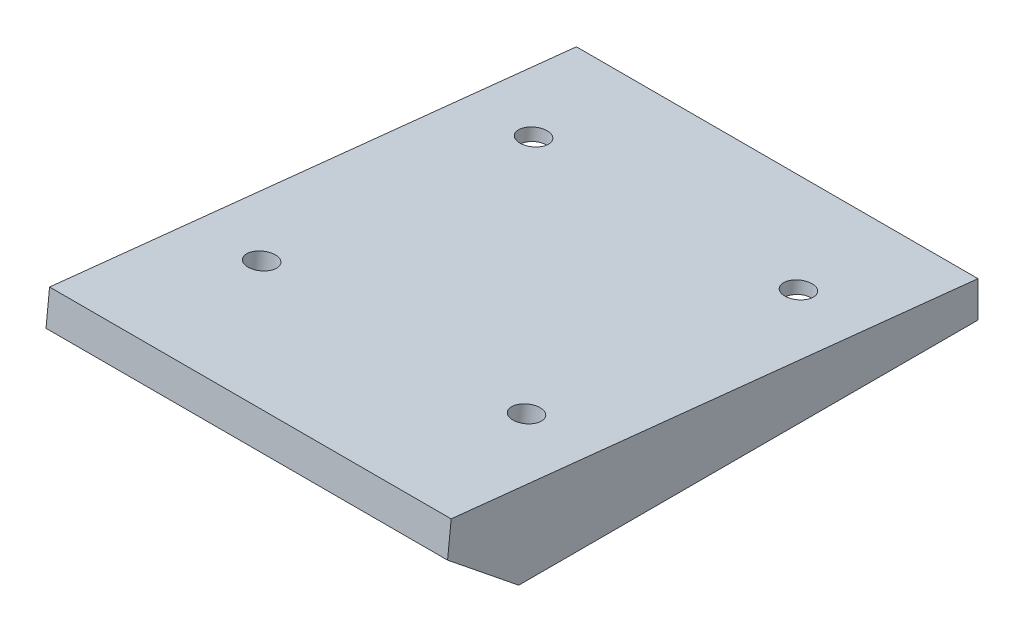
ISO-10303-21;
HEADER;
FILE_DESCRIPTION(('STEP AP214'),'2;1');
FILE_NAME('part.step','',(''),(''),'','','');
FILE_SCHEMA(('AUTOMOTIVE_DESIGN { 1 0 10303 214 1 1 1 1 }'));
ENDSEC;
DATA;
#1=APPLICATION_CONTEXT('core data for automotive mechanical design processes');
#2=APPLICATION_PROTOCOL_DEFINITION('international standard','automotive_design',2000,#1);
#3=PRODUCT_CONTEXT('',#1,'mechanical');
#4=PRODUCT('Part','Part','',(#3));
#5=PRODUCT_RELATED_PRODUCT_CATEGORY('part','',(#4));
#6=PRODUCT_DEFINITION_FORMATION('','',#4);
#7=PRODUCT_DEFINITION_CONTEXT('part definition',#1,'design');
#8=PRODUCT_DEFINITION('design','',#6,#7);
#9=PRODUCT_DEFINITION_SHAPE('','',#8);
#10=(LENGTH_UNIT() NAMED_UNIT(*) SI_UNIT(.MILLI.,.METRE.));
#11=(NAMED_UNIT(*) PLANE_ANGLE_UNIT() SI_UNIT($,.RADIAN.));
#12=(NAMED_UNIT(*) SI_UNIT($,.STERADIAN.) SOLID_ANGLE_UNIT());
#13=UNCERTAINTY_MEASURE_WITH_UNIT(LENGTH_MEASURE(1.E-05),#10,'distance_accuracy_value','');
#14=(GEOMETRIC_REPRESENTATION_CONTEXT(3) GLOBAL_UNCERTAINTY_ASSIGNED_CONTEXT((#13)) GLOBAL_UNIT_ASSIGNED_CONTEXT((#10,
#11,#12)) REPRESENTATION_CONTEXT('',''));
#15=CARTESIAN_POINT('',(0.,0.,0.));
#16=DIRECTION('',(0.,0.,1.));
#17=DIRECTION('',(1.,0.,0.));
#18=AXIS2_PLACEMENT_3D('',#15,#16,#17);
#19=CARTESIAN_POINT('',(-87.4905972521828,0.,0.));
#20=DIRECTION('',(0.,-1.,0.));
#21=DIRECTION('',(0.,0.,-1.));
#22=AXIS2_PLACEMENT_3D('',#19,#20,#21);
#23=PLANE('',#22);
#24=DIRECTION('',(0.,0.,-1.));
#25=VECTOR('',#24,1.);
#26=CARTESIAN_POINT('',(-22.5999999999999,0.,0.));
#27=LINE('',#26,#25);
#28=CARTESIAN_POINT('',(-22.5999999999999,0.,0.));
#29=VERTEX_POINT('',#28);
#30=CARTESIAN_POINT('',(-22.5999999999999,0.,-53.75));
#31=VERTEX_POINT('',#30);
#32=EDGE_CURVE('E152',#29,#31,#27,.T.);
#33=ORIENTED_EDGE('',*,*,#32,.F.);
#34=DIRECTION('',(1.,0.,0.));
#35=VECTOR('',#34,1.);
#36=CARTESIAN_POINT('',(-87.4905972521828,0.,0.));
#37=LINE('',#36,#35);
#38=CARTESIAN_POINT('',(-23.4999999999999,0.,0.));
#39=VERTEX_POINT('',#38);
#40=EDGE_CURVE('E211',#39,#29,#37,.T.);
#41=ORIENTED_EDGE('',*,*,#40,.F.);
#42=DIRECTION('',(0.,0.,1.));
#43=VECTOR('',#42,1.);
#44=CARTESIAN_POINT('',(-23.4999999999999,0.,0.));
#45=LINE('',#44,#43);
#46=CARTESIAN_POINT('',(-23.4999999999999,0.,-53.75));
#47=VERTEX_POINT('',#46);
#48=EDGE_CURVE('E197',#47,#39,#45,.T.);
#49=ORIENTED_EDGE('',*,*,#48,.F.);
#50=DIRECTION('',(1.,0.,0.));
#51=VECTOR('',#50,1.);
#52=CARTESIAN_POINT('',(-87.4905972521828,0.,-53.75));
#53=LINE('',#52,#51);
#54=EDGE_CURVE('E207',#47,#31,#53,.T.);
#55=ORIENTED_EDGE('',*,*,#54,.T.);
#56=EDGE_LOOP('',(#33,#41,#49,#55));
#57=FACE_BOUND('',#56,.T.);
#58=ADVANCED_FACE('F32',(#57),#23,.T.);
#59=CARTESIAN_POINT('',(-87.4905972521828,6.70267714112102,8.32847136590357));
#60=DIRECTION('',(0.,0.104528463267647,0.994521895368274));
#61=DIRECTION('',(0.,-0.994521895368274,0.104528463267647));
#62=AXIS2_PLACEMENT_3D('',#59,#60,#61);
#63=PLANE('',#62);
#64=DIRECTION('',(0.,0.994521895368274,-0.104528463267647));
#65=VECTOR('',#64,1.);
#66=CARTESIAN_POINT('',(-23.4999999999999,6.70267714112102,8.32847136590357));
#67=LINE('',#66,#65);
#68=CARTESIAN_POINT('',(-23.4999999999999,6.70267714112102,8.32847136590357));
#69=VERTEX_POINT('',#68);
#70=CARTESIAN_POINT('',(-23.4999999999999,10.6807647225941,7.91035751283298));
#71=VERTEX_POINT('',#70);
#72=EDGE_CURVE('E40',#69,#71,#67,.T.);
#73=ORIENTED_EDGE('',*,*,#72,.F.);
#74=DIRECTION('',(1.,0.,0.));
#75=VECTOR('',#74,1.);
#76=CARTESIAN_POINT('',(-87.4905972521828,6.70267714112102,8.32847136590357));
#77=LINE('',#76,#75);
#78=CARTESIAN_POINT('',(23.4999999999999,6.70267714112102,8.32847136590357));
#79=VERTEX_POINT('',#78);
#80=EDGE_CURVE('E194',#69,#79,#77,.T.);
#81=ORIENTED_EDGE('',*,*,#80,.T.);
#82=DIRECTION('',(0.,0.994521895368274,-0.104528463267647));
#83=VECTOR('',#82,1.);
#84=CARTESIAN_POINT('',(23.4999999999999,6.70267714112102,8.32847136590357));
#85=LINE('',#84,#83);
#86=CARTESIAN_POINT('',(23.4999999999999,10.6807647225941,7.91035751283298));
#87=VERTEX_POINT('',#86);
#88=EDGE_CURVE('E191',#79,#87,#85,.T.);
#89=ORIENTED_EDGE('',*,*,#88,.T.);
#90=DIRECTION('',(1.,0.,0.));
#91=VECTOR('',#90,1.);
#92=CARTESIAN_POINT('',(-87.4905972521828,10.6807647225941,7.91035751283298));
#93=LINE('',#92,#91);
#94=EDGE_CURVE('E199',#71,#87,#93,.T.);
#95=ORIENTED_EDGE('',*,*,#94,.F.);
#96=EDGE_LOOP('',(#73,#81,#89,#95));
#97=FACE_BOUND('',#96,.T.);
#98=ADVANCED_FACE('F34',(#97),#63,.T.);
#99=CARTESIAN_POINT('',(-87.4905972521828,4.2,-53.75));
#100=DIRECTION('',(0.,0.994521895368274,-0.104528463267646));
#101=DIRECTION('',(0.,0.104528463267646,0.994521895368274));
#102=AXIS2_PLACEMENT_3D('',#99,#100,#101);
#103=PLANE('',#102);
#104=CARTESIAN_POINT('',(-15.5,8.91292693972754,-8.90949544930517));
#105=DIRECTION('',(0.,0.994521895368274,-0.104528463267646));
#106=DIRECTION('',(0.,0.104528463267646,0.994521895368274));
#107=AXIS2_PLACEMENT_3D('',#104,#105,#106);
#108=CIRCLE('',#107,1.6);
#109=CARTESIAN_POINT('',(-15.5,9.08017248095578,-7.31826041671593));
#110=VERTEX_POINT('',#109);
#111=EDGE_CURVE('E131',#110,#110,#108,.T.);
#112=ORIENTED_EDGE('',*,*,#111,.F.);
#113=EDGE_LOOP('',(#112));
#114=FACE_BOUND('',#113,.T.);
#115=CARTESIAN_POINT('',(15.5,8.91292693972754,-8.90949544930516));
#116=DIRECTION('',(0.,0.994521895368274,-0.104528463267646));
#117=DIRECTION('',(0.,0.104528463267646,0.994521895368274));
#118=AXIS2_PLACEMENT_3D('',#115,#116,#117);
#119=CIRCLE('',#118,1.6);
#120=CARTESIAN_POINT('',(15.5,9.08017248095578,-7.31826041671592));
#121=VERTEX_POINT('',#120);
#122=EDGE_CURVE('E137',#121,#121,#119,.T.);
#123=ORIENTED_EDGE('',*,*,#122,.F.);
#124=EDGE_LOOP('',(#123));
#125=FACE_BOUND('',#124,.T.);
#126=CARTESIAN_POINT('',(15.5,5.56801611516286,-40.7341961010899));
#127=DIRECTION('',(0.,0.994521895368274,-0.104528463267646));
#128=DIRECTION('',(0.,0.104528463267646,0.994521895368274));
#129=AXIS2_PLACEMENT_3D('',#126,#127,#128);
#130=CIRCLE('',#129,1.6);
#131=CARTESIAN_POINT('',(15.5,5.73526165639109,-39.1429610685007));
#132=VERTEX_POINT('',#131);
#133=EDGE_CURVE('E143',#132,#132,#130,.T.);
#134=ORIENTED_EDGE('',*,*,#133,.F.);
#135=EDGE_LOOP('',(#134));
#136=FACE_BOUND('',#135,.T.);
#137=CARTESIAN_POINT('',(-15.5,5.56801611516286,-40.7341961010899));
#138=DIRECTION('',(0.,0.994521895368274,-0.104528463267646));
#139=DIRECTION('',(0.,0.104528463267646,0.994521895368274));
#140=AXIS2_PLACEMENT_3D('',#137,#138,#139);
#141=CIRCLE('',#140,1.60000000000001);
#142=CARTESIAN_POINT('',(-15.5,5.73526165639109,-39.1429610685007));
#143=VERTEX_POINT('',#142);
#144=EDGE_CURVE('E149',#143,#143,#141,.T.);
#145=ORIENTED_EDGE('',*,*,#144,.F.);
#146=EDGE_LOOP('',(#145));
#147=FACE_BOUND('',#146,.T.);
#148=DIRECTION('',(0.,-0.104528463267646,-0.994521895368274));
#149=VECTOR('',#148,1.);
#150=CARTESIAN_POINT('',(-23.4999999999999,4.2,-53.75));
#151=LINE('',#150,#149);
#152=CARTESIAN_POINT('',(-23.4999999999999,4.2,-53.75));
#153=VERTEX_POINT('',#152);
#154=EDGE_CURVE('E201',#71,#153,#151,.T.);
#155=ORIENTED_EDGE('',*,*,#154,.F.);
#156=ORIENTED_EDGE('',*,*,#94,.T.);
#157=DIRECTION('',(0.,-0.104528463267646,-0.994521895368274));
#158=VECTOR('',#157,1.);
#159=CARTESIAN_POINT('',(23.4999999999999,4.2,-53.75));
#160=LINE('',#159,#158);
#161=CARTESIAN_POINT('',(23.4999999999999,4.2,-53.75));
#162=VERTEX_POINT('',#161);
#163=EDGE_CURVE('E175',#87,#162,#160,.T.);
#164=ORIENTED_EDGE('',*,*,#163,.T.);
#165=DIRECTION('',(1.,0.,0.));
#166=VECTOR('',#165,1.);
#167=CARTESIAN_POINT('',(-87.4905972521828,4.2,-53.75));
#168=LINE('',#167,#166);
#169=EDGE_CURVE('E205',#153,#162,#168,.T.);
#170=ORIENTED_EDGE('',*,*,#169,.F.);
#171=EDGE_LOOP('',(#155,#156,#164,#170));
#172=FACE_BOUND('',#171,.T.);
#173=ADVANCED_FACE('F236',(#114,#125,#136,#147,#172),#103,.T.);
#174=CARTESIAN_POINT('',(-87.4905972521828,0.,-53.75));
#175=DIRECTION('',(0.,0.,-1.));
#176=DIRECTION('',(-1.,0.,0.));
#177=AXIS2_PLACEMENT_3D('',#174,#175,#176);
#178=PLANE('',#177);
#179=DIRECTION('',(0.,-1.,0.));
#180=VECTOR('',#179,1.);
#181=CARTESIAN_POINT('',(-22.5999999999999,4.05,-53.75));
#182=LINE('',#181,#180);
#183=CARTESIAN_POINT('',(-22.5999999999999,4.05,-53.75));
#184=VERTEX_POINT('',#183);
#185=EDGE_CURVE('E168',#184,#31,#182,.T.);
#186=ORIENTED_EDGE('',*,*,#185,.T.);
#187=ORIENTED_EDGE('',*,*,#54,.F.);
#188=DIRECTION('',(0.,-1.,0.));
#189=VECTOR('',#188,1.);
#190=CARTESIAN_POINT('',(-23.4999999999999,0.,-53.75));
#191=LINE('',#190,#189);
#192=EDGE_CURVE('E56',#153,#47,#191,.T.);
#193=ORIENTED_EDGE('',*,*,#192,.F.);
#194=ORIENTED_EDGE('',*,*,#169,.T.);
#195=DIRECTION('',(0.,-1.,0.));
#196=VECTOR('',#195,1.);
#197=CARTESIAN_POINT('',(23.4999999999999,0.,-53.75));
#198=LINE('',#197,#196);
#199=CARTESIAN_POINT('',(23.4999999999999,0.,-53.75));
#200=VERTEX_POINT('',#199);
#201=EDGE_CURVE('E182',#162,#200,#198,.T.);
#202=ORIENTED_EDGE('',*,*,#201,.T.);
#203=CARTESIAN_POINT('',(22.5999999999999,0.,-53.75));
#204=VERTEX_POINT('',#203);
#205=EDGE_CURVE('E210',#204,#200,#53,.T.);
#206=ORIENTED_EDGE('',*,*,#205,.F.);
#207=DIRECTION('',(0.,-1.,0.));
#208=VECTOR('',#207,1.);
#209=CARTESIAN_POINT('',(22.5999999999999,4.05,-53.75));
#210=LINE('',#209,#208);
#211=CARTESIAN_POINT('',(22.5999999999999,4.05,-53.75));
#212=VERTEX_POINT('',#211);
#213=EDGE_CURVE('E178',#212,#204,#210,.T.);
#214=ORIENTED_EDGE('',*,*,#213,.F.);
#215=DIRECTION('',(1.,0.,0.));
#216=VECTOR('',#215,1.);
#217=CARTESIAN_POINT('',(-22.5999999999999,4.05,-53.75));
#218=LINE('',#217,#216);
#219=EDGE_CURVE('E158',#184,#212,#218,.T.);
#220=ORIENTED_EDGE('',*,*,#219,.F.);
#221=EDGE_LOOP('',(#186,#187,#193,#194,#202,#206,#214,#220));
#222=FACE_BOUND('',#221,.T.);
#223=ADVANCED_FACE('F232',(#222),#178,.T.);
#224=DIRECTION('',(0.,0.,1.));
#225=VECTOR('',#224,1.);
#226=CARTESIAN_POINT('',(22.5999999999999,0.,0.));
#227=LINE('',#226,#225);
#228=CARTESIAN_POINT('',(22.5999999999999,0.,0.));
#229=VERTEX_POINT('',#228);
#230=EDGE_CURVE('E47',#204,#229,#227,.T.);
#231=ORIENTED_EDGE('',*,*,#230,.F.);
#232=ORIENTED_EDGE('',*,*,#205,.T.);
#233=DIRECTION('',(0.,0.,1.));
#234=VECTOR('',#233,1.);
#235=CARTESIAN_POINT('',(23.4999999999999,0.,0.));
#236=LINE('',#235,#234);
#237=CARTESIAN_POINT('',(23.4999999999999,0.,0.));
#238=VERTEX_POINT('',#237);
#239=EDGE_CURVE('E185',#200,#238,#236,.T.);
#240=ORIENTED_EDGE('',*,*,#239,.T.);
#241=EDGE_CURVE('E213',#229,#238,#37,.T.);
#242=ORIENTED_EDGE('',*,*,#241,.F.);
#243=EDGE_LOOP('',(#231,#232,#240,#242));
#244=FACE_BOUND('',#243,.T.);
#245=ADVANCED_FACE('F228',(#244),#23,.T.);
#246=CARTESIAN_POINT('',(-87.4905972521828,0.,0.));
#247=DIRECTION('',(0.,-0.779044883952261,0.626968156119438));
#248=DIRECTION('',(0.,-0.626968156119438,-0.779044883952261));
#249=AXIS2_PLACEMENT_3D('',#246,#247,#248);
#250=PLANE('',#249);
#251=CARTESIAN_POINT('',(-13.4999999999999,3.4785766463036,4.32233649075853));
#252=DIRECTION('',(0.,-0.779044883952261,0.626968156119438));
#253=DIRECTION('',(0.,-0.626968156119438,-0.779044883952261));
#254=AXIS2_PLACEMENT_3D('',#251,#252,#253);
#255=CIRCLE('',#254,1.24999999999999);
#256=CARTESIAN_POINT('',(-13.4999999999999,2.69486645115431,3.34853038581821));
#257=VERTEX_POINT('',#256);
#258=EDGE_CURVE('E120',#257,#257,#255,.T.);
#259=ORIENTED_EDGE('',*,*,#258,.F.);
#260=EDGE_LOOP('',(#259));
#261=FACE_BOUND('',#260,.T.);
#262=CARTESIAN_POINT('',(13.4999999999999,3.4785766463036,4.32233649075852));
#263=DIRECTION('',(0.,-0.779044883952261,0.626968156119438));
#264=DIRECTION('',(0.,-0.626968156119438,-0.779044883952261));
#265=AXIS2_PLACEMENT_3D('',#262,#263,#264);
#266=CIRCLE('',#265,1.24999999999999);
#267=CARTESIAN_POINT('',(13.4999999999999,2.69486645115431,3.34853038581821));
#268=VERTEX_POINT('',#267);
#269=EDGE_CURVE('E119',#268,#268,#266,.T.);
#270=ORIENTED_EDGE('',*,*,#269,.F.);
#271=EDGE_LOOP('',(#270));
#272=FACE_BOUND('',#271,.T.);
#273=DIRECTION('',(0.,0.626968156119438,0.779044883952261));
#274=VECTOR('',#273,1.);
#275=CARTESIAN_POINT('',(-23.4999999999999,0.,0.));
#276=LINE('',#275,#274);
#277=EDGE_CURVE('E11',#39,#69,#276,.T.);
#278=ORIENTED_EDGE('',*,*,#277,.F.);
#279=ORIENTED_EDGE('',*,*,#40,.T.);
#280=DIRECTION('',(-1.,0.,0.));
#281=VECTOR('',#280,1.);
#282=CARTESIAN_POINT('',(-22.5999999999999,0.,0.));
#283=LINE('',#282,#281);
#284=EDGE_CURVE('E159',#229,#29,#283,.T.);
#285=ORIENTED_EDGE('',*,*,#284,.F.);
#286=ORIENTED_EDGE('',*,*,#241,.T.);
#287=DIRECTION('',(0.,0.626968156119438,0.779044883952261));
#288=VECTOR('',#287,1.);
#289=CARTESIAN_POINT('',(23.4999999999999,0.,0.));
#290=LINE('',#289,#288);
#291=EDGE_CURVE('E188',#238,#79,#290,.T.);
#292=ORIENTED_EDGE('',*,*,#291,.T.);
#293=ORIENTED_EDGE('',*,*,#80,.F.);
#294=EDGE_LOOP('',(#278,#279,#285,#286,#292,#293));
#295=FACE_BOUND('',#294,.T.);
#296=ADVANCED_FACE('F221',(#261,#272,#295),#250,.T.);
#297=CARTESIAN_POINT('',(-23.4999999999999,0.0499999999999997,0.));
#298=DIRECTION('',(1.,0.,0.));
#299=DIRECTION('',(0.,0.,-1.));
#300=AXIS2_PLACEMENT_3D('',#297,#298,#299);
#301=PLANE('',#300);
#302=ORIENTED_EDGE('',*,*,#72,.T.);
#303=ORIENTED_EDGE('',*,*,#154,.T.);
#304=ORIENTED_EDGE('',*,*,#192,.T.);
#305=ORIENTED_EDGE('',*,*,#48,.T.);
#306=ORIENTED_EDGE('',*,*,#277,.T.);
#307=EDGE_LOOP('',(#302,#303,#304,#305,#306));
#308=FACE_BOUND('',#307,.T.);
#309=ADVANCED_FACE('F273',(#308),#301,.F.);
#310=CARTESIAN_POINT('',(23.4999999999999,0.0499999999999997,0.));
#311=DIRECTION('',(-1.,0.,0.));
#312=DIRECTION('',(0.,0.,1.));
#313=AXIS2_PLACEMENT_3D('',#310,#311,#312);
#314=PLANE('',#313);
#315=ORIENTED_EDGE('',*,*,#291,.F.);
#316=ORIENTED_EDGE('',*,*,#239,.F.);
#317=ORIENTED_EDGE('',*,*,#201,.F.);
#318=ORIENTED_EDGE('',*,*,#163,.F.);
#319=ORIENTED_EDGE('',*,*,#88,.F.);
#320=EDGE_LOOP('',(#315,#316,#317,#318,#319));
#321=FACE_BOUND('',#320,.T.);
#322=ADVANCED_FACE('F225',(#321),#314,.F.);
#323=CARTESIAN_POINT('',(-22.5999999999999,4.05,0.));
#324=DIRECTION('',(-1.,0.,0.));
#325=DIRECTION('',(0.,0.,1.));
#326=AXIS2_PLACEMENT_3D('',#323,#324,#325);
#327=PLANE('',#326);
#328=ORIENTED_EDGE('',*,*,#32,.T.);
#329=ORIENTED_EDGE('',*,*,#185,.F.);
#330=DIRECTION('',(0.,0.,-1.));
#331=VECTOR('',#330,1.);
#332=CARTESIAN_POINT('',(-22.5999999999999,4.05,0.));
#333=LINE('',#332,#331);
#334=CARTESIAN_POINT('',(-22.5999999999999,4.05,0.));
#335=VERTEX_POINT('',#334);
#336=EDGE_CURVE('E155',#335,#184,#333,.T.);
#337=ORIENTED_EDGE('',*,*,#336,.F.);
#338=DIRECTION('',(0.,-1.,0.));
#339=VECTOR('',#338,1.);
#340=CARTESIAN_POINT('',(-22.5999999999999,4.05,0.));
#341=LINE('',#340,#339);
#342=EDGE_CURVE('E173',#335,#29,#341,.T.);
#343=ORIENTED_EDGE('',*,*,#342,.T.);
#344=EDGE_LOOP('',(#328,#329,#337,#343));
#345=FACE_BOUND('',#344,.T.);
#346=ADVANCED_FACE('F243',(#345),#327,.F.);
#347=CARTESIAN_POINT('',(-22.5999999999999,4.05,0.));
#348=DIRECTION('',(0.,0.,1.));
#349=DIRECTION('',(1.,0.,0.));
#350=AXIS2_PLACEMENT_3D('',#347,#348,#349);
#351=PLANE('',#350);
#352=ORIENTED_EDGE('',*,*,#284,.T.);
#353=ORIENTED_EDGE('',*,*,#342,.F.);
#354=DIRECTION('',(-1.,0.,0.));
#355=VECTOR('',#354,1.);
#356=CARTESIAN_POINT('',(-22.5999999999999,4.05,0.));
#357=LINE('',#356,#355);
#358=CARTESIAN_POINT('',(22.5999999999999,4.05,0.));
#359=VERTEX_POINT('',#358);
#360=EDGE_CURVE('E165',#359,#335,#357,.T.);
#361=ORIENTED_EDGE('',*,*,#360,.F.);
#362=DIRECTION('',(0.,-1.,0.));
#363=VECTOR('',#362,1.);
#364=CARTESIAN_POINT('',(22.5999999999999,4.05,0.));
#365=LINE('',#364,#363);
#366=EDGE_CURVE('E176',#359,#229,#365,.T.);
#367=ORIENTED_EDGE('',*,*,#366,.T.);
#368=EDGE_LOOP('',(#352,#353,#361,#367));
#369=FACE_BOUND('',#368,.T.);
#370=ADVANCED_FACE('F249',(#369),#351,.F.);
#371=CARTESIAN_POINT('',(22.5999999999999,4.05,0.));
#372=DIRECTION('',(1.,0.,0.));
#373=DIRECTION('',(0.,0.,-1.));
#374=AXIS2_PLACEMENT_3D('',#371,#372,#373);
#375=PLANE('',#374);
#376=ORIENTED_EDGE('',*,*,#230,.T.);
#377=ORIENTED_EDGE('',*,*,#366,.F.);
#378=DIRECTION('',(0.,0.,1.));
#379=VECTOR('',#378,1.);
#380=CARTESIAN_POINT('',(22.5999999999999,4.05,0.));
#381=LINE('',#380,#379);
#382=EDGE_CURVE('E162',#212,#359,#381,.T.);
#383=ORIENTED_EDGE('',*,*,#382,.F.);
#384=ORIENTED_EDGE('',*,*,#213,.T.);
#385=EDGE_LOOP('',(#376,#377,#383,#384));
#386=FACE_BOUND('',#385,.T.);
#387=ADVANCED_FACE('F250',(#386),#375,.F.);
#388=CARTESIAN_POINT('',(0.,4.05,0.));
#389=DIRECTION('',(0.,-1.,0.));
#390=DIRECTION('',(0.,0.,-1.));
#391=AXIS2_PLACEMENT_3D('',#388,#389,#390);
#392=PLANE('',#391);
#393=CARTESIAN_POINT('',(-15.5,4.05,-8.39838123215228));
#394=DIRECTION('',(0.,-1.,0.));
#395=DIRECTION('',(0.,0.,-1.));
#396=AXIS2_PLACEMENT_3D('',#393,#394,#395);
#397=ELLIPSE('',#396,1.60881324730163,1.6);
#398=CARTESIAN_POINT('',(-15.5,4.05,-10.0071944794539));
#399=VERTEX_POINT('',#398);
#400=EDGE_CURVE('E130',#399,#399,#397,.F.);
#401=ORIENTED_EDGE('',*,*,#400,.T.);
#402=EDGE_LOOP('',(#401));
#403=FACE_BOUND('',#402,.T.);
#404=CARTESIAN_POINT('',(15.5,4.05,-8.39838123215228));
#405=DIRECTION('',(0.,-1.,0.));
#406=DIRECTION('',(0.,0.,-1.));
#407=AXIS2_PLACEMENT_3D('',#404,#405,#406);
#408=ELLIPSE('',#407,1.60881324730163,1.6);
#409=CARTESIAN_POINT('',(15.5,4.05,-10.0071944794539));
#410=VERTEX_POINT('',#409);
#411=EDGE_CURVE('E134',#410,#410,#408,.F.);
#412=ORIENTED_EDGE('',*,*,#411,.T.);
#413=EDGE_LOOP('',(#412));
#414=FACE_BOUND('',#413,.T.);
#415=CARTESIAN_POINT('',(15.5,4.05,-40.5746461781848));
#416=DIRECTION('',(0.,-1.,0.));
#417=DIRECTION('',(0.,0.,-1.));
#418=AXIS2_PLACEMENT_3D('',#415,#416,#417);
#419=ELLIPSE('',#418,1.60881324730163,1.6);
#420=CARTESIAN_POINT('',(15.5,4.05,-42.1834594254864));
#421=VERTEX_POINT('',#420);
#422=EDGE_CURVE('E140',#421,#421,#419,.F.);
#423=ORIENTED_EDGE('',*,*,#422,.T.);
#424=EDGE_LOOP('',(#423));
#425=FACE_BOUND('',#424,.T.);
#426=CARTESIAN_POINT('',(-15.5,4.05,-40.5746461781848));
#427=DIRECTION('',(0.,-1.,0.));
#428=DIRECTION('',(0.,0.,-1.));
#429=AXIS2_PLACEMENT_3D('',#426,#427,#428);
#430=ELLIPSE('',#429,1.60881324730163,1.60000000000001);
#431=CARTESIAN_POINT('',(-15.5,4.05,-42.1834594254864));
#432=VERTEX_POINT('',#431);
#433=EDGE_CURVE('E146',#432,#432,#430,.F.);
#434=ORIENTED_EDGE('',*,*,#433,.T.);
#435=EDGE_LOOP('',(#434));
#436=FACE_BOUND('',#435,.T.);
#437=ORIENTED_EDGE('',*,*,#336,.T.);
#438=ORIENTED_EDGE('',*,*,#219,.T.);
#439=ORIENTED_EDGE('',*,*,#382,.T.);
#440=ORIENTED_EDGE('',*,*,#360,.T.);
#441=EDGE_LOOP('',(#437,#438,#439,#440));
#442=FACE_BOUND('',#441,.T.);
#443=ADVANCED_FACE('F246',(#403,#414,#425,#436,#442),#392,.T.);
#444=CARTESIAN_POINT('',(-15.5,-5.04060684855692,-39.6191848972664));
#445=DIRECTION('',(0.,0.994521895368274,-0.104528463267646));
#446=DIRECTION('',(0.,0.104528463267646,0.994521895368274));
#447=AXIS2_PLACEMENT_3D('',#444,#445,#446);
#448=CYLINDRICAL_SURFACE('',#447,1.60000000000001);
#449=ORIENTED_EDGE('',*,*,#433,.F.);
#450=EDGE_LOOP('',(#449));
#451=FACE_BOUND('',#450,.T.);
#452=ORIENTED_EDGE('',*,*,#144,.T.);
#453=EDGE_LOOP('',(#452));
#454=FACE_BOUND('',#453,.T.);
#455=ADVANCED_FACE('F257',(#451,#454),#448,.F.);
#456=CARTESIAN_POINT('',(15.5,-5.04060684855692,-39.6191848972664));
#457=DIRECTION('',(0.,0.994521895368274,-0.104528463267646));
#458=DIRECTION('',(0.,0.104528463267646,0.994521895368274));
#459=AXIS2_PLACEMENT_3D('',#456,#457,#458);
#460=CYLINDRICAL_SURFACE('',#459,1.6);
#461=ORIENTED_EDGE('',*,*,#422,.F.);
#462=EDGE_LOOP('',(#461));
#463=FACE_BOUND('',#462,.T.);
#464=ORIENTED_EDGE('',*,*,#133,.T.);
#465=EDGE_LOOP('',(#464));
#466=FACE_BOUND('',#465,.T.);
#467=ADVANCED_FACE('F320',(#463,#466),#460,.F.);
#468=CARTESIAN_POINT('',(15.5,-1.69569602399223,-7.79448424548158));
#469=DIRECTION('',(0.,0.994521895368274,-0.104528463267646));
#470=DIRECTION('',(0.,0.104528463267646,0.994521895368274));
#471=AXIS2_PLACEMENT_3D('',#468,#469,#470);
#472=CYLINDRICAL_SURFACE('',#471,1.6);
#473=ORIENTED_EDGE('',*,*,#411,.F.);
#474=EDGE_LOOP('',(#473));
#475=FACE_BOUND('',#474,.T.);
#476=ORIENTED_EDGE('',*,*,#122,.T.);
#477=EDGE_LOOP('',(#476));
#478=FACE_BOUND('',#477,.T.);
#479=ADVANCED_FACE('F330',(#475,#478),#472,.F.);
#480=CARTESIAN_POINT('',(-15.5,-1.69569602399223,-7.79448424548158));
#481=DIRECTION('',(0.,0.994521895368274,-0.104528463267646));
#482=DIRECTION('',(0.,0.104528463267646,0.994521895368274));
#483=AXIS2_PLACEMENT_3D('',#480,#481,#482);
#484=CYLINDRICAL_SURFACE('',#483,1.6);
#485=ORIENTED_EDGE('',*,*,#400,.F.);
#486=EDGE_LOOP('',(#485));
#487=FACE_BOUND('',#486,.T.);
#488=ORIENTED_EDGE('',*,*,#111,.T.);
#489=EDGE_LOOP('',(#488));
#490=FACE_BOUND('',#489,.T.);
#491=ADVANCED_FACE('F340',(#487,#490),#484,.F.);
#492=CARTESIAN_POINT('',(13.4999999999999,7.37380106606491,1.18749571016133));
#493=DIRECTION('',(0.,-0.779044883952261,0.626968156119438));
#494=DIRECTION('',(0.,-0.626968156119438,-0.779044883952261));
#495=AXIS2_PLACEMENT_3D('',#492,#493,#494);
#496=CONICAL_SURFACE('',#495,1.24999999999999,1.02974425867665);
#497=CARTESIAN_POINT('',(13.4999999999999,7.95892280509217,0.716595117165716));
#498=VERTEX_POINT('',#497);
#499=VERTEX_LOOP('',#498);
#500=FACE_BOUND('',#499,.T.);
#501=CARTESIAN_POINT('',(13.4999999999999,7.37380106606491,1.18749571016133));
#502=DIRECTION('',(0.,-0.779044883952261,0.626968156119438));
#503=DIRECTION('',(0.,-0.626968156119438,-0.779044883952261));
#504=AXIS2_PLACEMENT_3D('',#501,#502,#503);
#505=CIRCLE('',#504,1.24999999999999);
#506=CARTESIAN_POINT('',(13.4999999999999,6.59009087091562,0.213689605221013));
#507=VERTEX_POINT('',#506);
#508=EDGE_CURVE('E123',#507,#507,#505,.T.);
#509=ORIENTED_EDGE('',*,*,#508,.T.);
#510=EDGE_LOOP('',(#509));
#511=FACE_BOUND('',#510,.T.);
#512=ADVANCED_FACE('F350',(#500,#511),#496,.F.);
#513=CARTESIAN_POINT('',(13.4999999999999,3.4785766463036,4.32233649075852));
#514=DIRECTION('',(0.,-0.779044883952261,0.626968156119438));
#515=DIRECTION('',(0.,-0.626968156119438,-0.779044883952261));
#516=AXIS2_PLACEMENT_3D('',#513,#514,#515);
#517=CYLINDRICAL_SURFACE('',#516,1.24999999999999);
#518=ORIENTED_EDGE('',*,*,#508,.F.);
#519=EDGE_LOOP('',(#518));
#520=FACE_BOUND('',#519,.T.);
#521=ORIENTED_EDGE('',*,*,#269,.T.);
#522=EDGE_LOOP('',(#521));
#523=FACE_BOUND('',#522,.T.);
#524=ADVANCED_FACE('F113',(#520,#523),#517,.F.);
#525=CARTESIAN_POINT('',(-13.4999999999999,7.37380106606491,1.18749571016133));
#526=DIRECTION('',(0.,-0.779044883952261,0.626968156119438));
#527=DIRECTION('',(0.,-0.626968156119438,-0.779044883952261));
#528=AXIS2_PLACEMENT_3D('',#525,#526,#527);
#529=CONICAL_SURFACE('',#528,1.24999999999999,1.02974425867665);
#530=CARTESIAN_POINT('',(-13.4999999999999,7.95892280509217,0.716595117165718));
#531=VERTEX_POINT('',#530);
#532=VERTEX_LOOP('',#531);
#533=FACE_BOUND('',#532,.T.);
#534=CARTESIAN_POINT('',(-13.4999999999999,7.37380106606491,1.18749571016133));
#535=DIRECTION('',(0.,-0.779044883952261,0.626968156119438));
#536=DIRECTION('',(0.,-0.626968156119438,-0.779044883952261));
#537=AXIS2_PLACEMENT_3D('',#534,#535,#536);
#538=CIRCLE('',#537,1.24999999999999);
#539=CARTESIAN_POINT('',(-13.4999999999999,6.59009087091562,0.213689605221015));
#540=VERTEX_POINT('',#539);
#541=EDGE_CURVE('E117',#540,#540,#538,.T.);
#542=ORIENTED_EDGE('',*,*,#541,.T.);
#543=EDGE_LOOP('',(#542));
#544=FACE_BOUND('',#543,.T.);
#545=ADVANCED_FACE('F109',(#533,#544),#529,.F.);
#546=CARTESIAN_POINT('',(-13.4999999999999,3.4785766463036,4.32233649075853));
#547=DIRECTION('',(0.,-0.779044883952261,0.626968156119438));
#548=DIRECTION('',(0.,-0.626968156119438,-0.779044883952261));
#549=AXIS2_PLACEMENT_3D('',#546,#547,#548);
#550=CYLINDRICAL_SURFACE('',#549,1.24999999999999);
#551=ORIENTED_EDGE('',*,*,#541,.F.);
#552=EDGE_LOOP('',(#551));
#553=FACE_BOUND('',#552,.T.);
#554=ORIENTED_EDGE('',*,*,#258,.T.);
#555=EDGE_LOOP('',(#554));
#556=FACE_BOUND('',#555,.T.);
#557=ADVANCED_FACE('F112',(#553,#556),#550,.F.);
#558=CLOSED_SHELL('',(#58,#98,#173,#223,#245,#296,#309,#322,#346,#370,#387,#443,#455,#467,#479,
#491,#512,#524,#545,#557));
#559=MANIFOLD_SOLID_BREP('B2',#558);
#560=ADVANCED_BREP_SHAPE_REPRESENTATION('',(#18,#559),#14);
#561=SHAPE_DEFINITION_REPRESENTATION(#9,#560);
ENDSEC;
END-ISO-10303-21;
